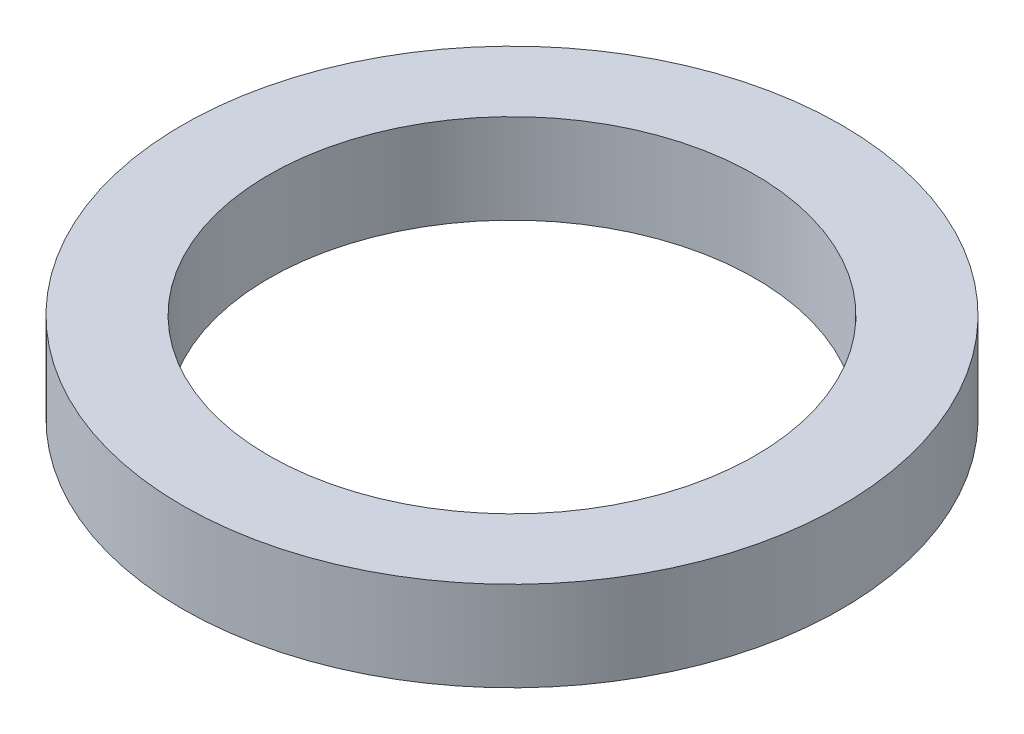
ISO-10303-21;
HEADER;
FILE_DESCRIPTION(('STEP AP214'),'2;1');
FILE_NAME('part.step','',(''),(''),'','','');
FILE_SCHEMA(('AUTOMOTIVE_DESIGN { 1 0 10303 214 1 1 1 1 }'));
ENDSEC;
DATA;
#1=APPLICATION_CONTEXT('core data for automotive mechanical design processes');
#2=APPLICATION_PROTOCOL_DEFINITION('international standard','automotive_design',2000,#1);
#3=PRODUCT_CONTEXT('',#1,'mechanical');
#4=PRODUCT('Part','Part','',(#3));
#5=PRODUCT_RELATED_PRODUCT_CATEGORY('part','',(#4));
#6=PRODUCT_DEFINITION_FORMATION('','',#4);
#7=PRODUCT_DEFINITION_CONTEXT('part definition',#1,'design');
#8=PRODUCT_DEFINITION('design','',#6,#7);
#9=PRODUCT_DEFINITION_SHAPE('','',#8);
#10=(LENGTH_UNIT() NAMED_UNIT(*) SI_UNIT(.MILLI.,.METRE.));
#11=(NAMED_UNIT(*) PLANE_ANGLE_UNIT() SI_UNIT($,.RADIAN.));
#12=(NAMED_UNIT(*) SI_UNIT($,.STERADIAN.) SOLID_ANGLE_UNIT());
#13=UNCERTAINTY_MEASURE_WITH_UNIT(LENGTH_MEASURE(1.E-05),#10,'distance_accuracy_value','');
#14=(GEOMETRIC_REPRESENTATION_CONTEXT(3) GLOBAL_UNCERTAINTY_ASSIGNED_CONTEXT((#13)) GLOBAL_UNIT_ASSIGNED_CONTEXT((#10,
#11,#12)) REPRESENTATION_CONTEXT('',''));
#15=CARTESIAN_POINT('',(0.,0.,0.));
#16=DIRECTION('',(0.,0.,1.));
#17=DIRECTION('',(1.,0.,0.));
#18=AXIS2_PLACEMENT_3D('',#15,#16,#17);
#19=CARTESIAN_POINT('',(0.,4.515,0.));
#20=DIRECTION('',(0.,1.,0.));
#21=DIRECTION('',(0.,0.,1.));
#22=AXIS2_PLACEMENT_3D('',#19,#20,#21);
#23=PLANE('',#22);
#24=CARTESIAN_POINT('',(0.,4.515,0.));
#25=DIRECTION('',(0.,1.,0.));
#26=DIRECTION('',(0.,0.,1.));
#27=AXIS2_PLACEMENT_3D('',#24,#25,#26);
#28=CIRCLE('',#27,33.195);
#29=CARTESIAN_POINT('',(0.,4.515,33.195));
#30=VERTEX_POINT('',#29);
#31=EDGE_CURVE('E10',#30,#30,#28,.T.);
#32=ORIENTED_EDGE('',*,*,#31,.T.);
#33=EDGE_LOOP('',(#32));
#34=FACE_BOUND('',#33,.T.);
#35=CARTESIAN_POINT('',(0.,4.515,0.));
#36=DIRECTION('',(0.,1.,0.));
#37=DIRECTION('',(0.,0.,1.));
#38=AXIS2_PLACEMENT_3D('',#35,#36,#37);
#39=CIRCLE('',#38,24.5);
#40=CARTESIAN_POINT('',(0.,4.515,24.5));
#41=VERTEX_POINT('',#40);
#42=EDGE_CURVE('E48',#41,#41,#39,.T.);
#43=ORIENTED_EDGE('',*,*,#42,.F.);
#44=EDGE_LOOP('',(#43));
#45=FACE_BOUND('',#44,.T.);
#46=ADVANCED_FACE('F37',(#34,#45),#23,.T.);
#47=CARTESIAN_POINT('',(0.,-4.515,0.));
#48=DIRECTION('',(0.,1.,0.));
#49=DIRECTION('',(0.,0.,1.));
#50=AXIS2_PLACEMENT_3D('',#47,#48,#49);
#51=PLANE('',#50);
#52=CARTESIAN_POINT('',(0.,-4.515,0.));
#53=DIRECTION('',(0.,1.,0.));
#54=DIRECTION('',(0.,0.,1.));
#55=AXIS2_PLACEMENT_3D('',#52,#53,#54);
#56=CIRCLE('',#55,33.195);
#57=CARTESIAN_POINT('',(0.,-4.515,33.195));
#58=VERTEX_POINT('',#57);
#59=EDGE_CURVE('E41',#58,#58,#56,.T.);
#60=ORIENTED_EDGE('',*,*,#59,.F.);
#61=EDGE_LOOP('',(#60));
#62=FACE_BOUND('',#61,.T.);
#63=CARTESIAN_POINT('',(0.,-4.515,0.));
#64=DIRECTION('',(0.,1.,0.));
#65=DIRECTION('',(0.,0.,1.));
#66=AXIS2_PLACEMENT_3D('',#63,#64,#65);
#67=CIRCLE('',#66,24.5);
#68=CARTESIAN_POINT('',(0.,-4.515,24.5));
#69=VERTEX_POINT('',#68);
#70=EDGE_CURVE('E50',#69,#69,#67,.T.);
#71=ORIENTED_EDGE('',*,*,#70,.T.);
#72=EDGE_LOOP('',(#71));
#73=FACE_BOUND('',#72,.T.);
#74=ADVANCED_FACE('F60',(#62,#73),#51,.F.);
#75=CARTESIAN_POINT('',(0.,4.515,0.));
#76=DIRECTION('',(0.,-1.,0.));
#77=DIRECTION('',(0.,0.,-1.));
#78=AXIS2_PLACEMENT_3D('',#75,#76,#77);
#79=CYLINDRICAL_SURFACE('',#78,33.195);
#80=ORIENTED_EDGE('',*,*,#31,.F.);
#81=EDGE_LOOP('',(#80));
#82=FACE_BOUND('',#81,.T.);
#83=ORIENTED_EDGE('',*,*,#59,.T.);
#84=EDGE_LOOP('',(#83));
#85=FACE_BOUND('',#84,.T.);
#86=ADVANCED_FACE('F39',(#82,#85),#79,.T.);
#87=CARTESIAN_POINT('',(0.,4.515,0.));
#88=DIRECTION('',(0.,-1.,0.));
#89=DIRECTION('',(0.,0.,-1.));
#90=AXIS2_PLACEMENT_3D('',#87,#88,#89);
#91=CYLINDRICAL_SURFACE('',#90,24.5);
#92=ORIENTED_EDGE('',*,*,#42,.T.);
#93=EDGE_LOOP('',(#92));
#94=FACE_BOUND('',#93,.T.);
#95=ORIENTED_EDGE('',*,*,#70,.F.);
#96=EDGE_LOOP('',(#95));
#97=FACE_BOUND('',#96,.T.);
#98=ADVANCED_FACE('F56',(#94,#97),#91,.F.);
#99=CLOSED_SHELL('',(#46,#74,#86,#98));
#100=MANIFOLD_SOLID_BREP('B2',#99);
#101=ADVANCED_BREP_SHAPE_REPRESENTATION('',(#18,#100),#14);
#102=SHAPE_DEFINITION_REPRESENTATION(#9,#101);
ENDSEC;
END-ISO-10303-21;
